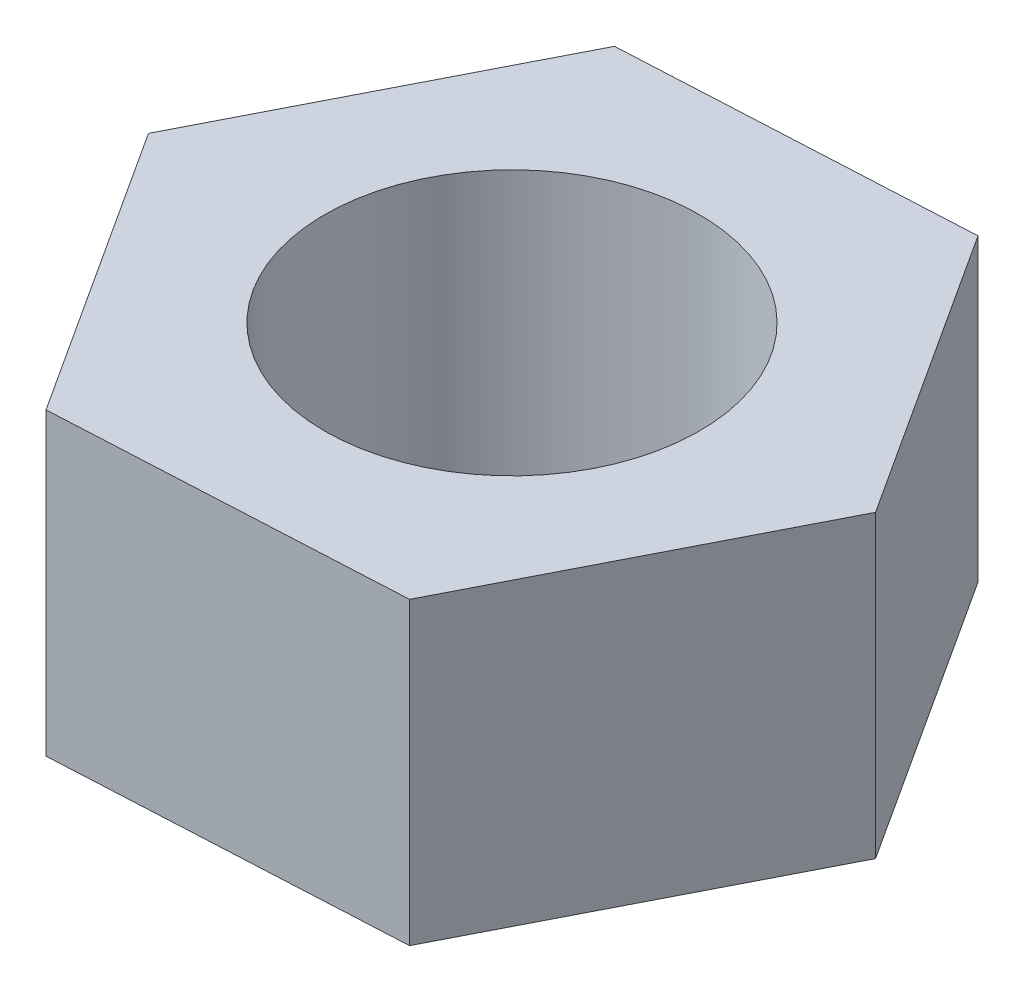
ISO-10303-21;
HEADER;
FILE_DESCRIPTION(('STEP AP214'),'2;1');
FILE_NAME('part.step','',(''),(''),'','','');
FILE_SCHEMA(('AUTOMOTIVE_DESIGN { 1 0 10303 214 1 1 1 1 }'));
ENDSEC;
DATA;
#1=APPLICATION_CONTEXT('core data for automotive mechanical design processes');
#2=APPLICATION_PROTOCOL_DEFINITION('international standard','automotive_design',2000,#1);
#3=PRODUCT_CONTEXT('',#1,'mechanical');
#4=PRODUCT('Part','Part','',(#3));
#5=PRODUCT_RELATED_PRODUCT_CATEGORY('part','',(#4));
#6=PRODUCT_DEFINITION_FORMATION('','',#4);
#7=PRODUCT_DEFINITION_CONTEXT('part definition',#1,'design');
#8=PRODUCT_DEFINITION('design','',#6,#7);
#9=PRODUCT_DEFINITION_SHAPE('','',#8);
#10=(LENGTH_UNIT() NAMED_UNIT(*) SI_UNIT(.MILLI.,.METRE.));
#11=(NAMED_UNIT(*) PLANE_ANGLE_UNIT() SI_UNIT($,.RADIAN.));
#12=(NAMED_UNIT(*) SI_UNIT($,.STERADIAN.) SOLID_ANGLE_UNIT());
#13=UNCERTAINTY_MEASURE_WITH_UNIT(LENGTH_MEASURE(1.E-05),#10,'distance_accuracy_value','');
#14=(GEOMETRIC_REPRESENTATION_CONTEXT(3) GLOBAL_UNCERTAINTY_ASSIGNED_CONTEXT((#13)) GLOBAL_UNIT_ASSIGNED_CONTEXT((#10,
#11,#12)) REPRESENTATION_CONTEXT('',''));
#15=CARTESIAN_POINT('',(0.,0.,0.));
#16=DIRECTION('',(0.,0.,1.));
#17=DIRECTION('',(1.,0.,0.));
#18=AXIS2_PLACEMENT_3D('',#15,#16,#17);
#19=CARTESIAN_POINT('',(0.,10.16,0.));
#20=DIRECTION('',(0.,1.,0.));
#21=DIRECTION('',(0.,0.,1.));
#22=AXIS2_PLACEMENT_3D('',#19,#20,#21);
#23=PLANE('',#22);
#24=DIRECTION('',(0.998697463327456,0.,-0.0510232960842927));
#25=VECTOR('',#24,1.);
#26=CARTESIAN_POINT('',(-5.33984152458119,10.16,10.4460626948957));
#27=LINE('',#26,#25);
#28=CARTESIAN_POINT('',(-5.33984152458119,10.16,10.4460626948957));
#29=VERTEX_POINT('',#28);
#30=CARTESIAN_POINT('',(6.37663490101402,10.16,9.84746975991819));
#31=VERTEX_POINT('',#30);
#32=EDGE_CURVE('E157',#29,#31,#27,.T.);
#33=ORIENTED_EDGE('',*,*,#32,.T.);
#34=DIRECTION('',(0.455161261069915,0.,-0.890409021978801));
#35=VECTOR('',#34,1.);
#36=CARTESIAN_POINT('',(6.37663490101402,10.16,9.84746975991819));
#37=LINE('',#36,#35);
#38=CARTESIAN_POINT('',(11.7164764255952,10.16,-0.598592934977514));
#39=VERTEX_POINT('',#38);
#40=EDGE_CURVE('E104',#31,#39,#37,.T.);
#41=ORIENTED_EDGE('',*,*,#40,.T.);
#42=DIRECTION('',(-0.54353620225754,0.,-0.839385725894508));
#43=VECTOR('',#42,1.);
#44=CARTESIAN_POINT('',(11.7164764255952,10.16,-0.598592934977514));
#45=LINE('',#44,#43);
#46=CARTESIAN_POINT('',(5.33984152458119,10.16,-10.4460626948957));
#47=VERTEX_POINT('',#46);
#48=EDGE_CURVE('E117',#39,#47,#45,.T.);
#49=ORIENTED_EDGE('',*,*,#48,.T.);
#50=DIRECTION('',(-0.998697463327456,0.,0.0510232960842926));
#51=VECTOR('',#50,1.);
#52=CARTESIAN_POINT('',(5.33984152458119,10.16,-10.4460626948957));
#53=LINE('',#52,#51);
#54=CARTESIAN_POINT('',(-6.37663490101401,10.16,-9.84746975991819));
#55=VERTEX_POINT('',#54);
#56=EDGE_CURVE('E111',#47,#55,#53,.T.);
#57=ORIENTED_EDGE('',*,*,#56,.T.);
#58=DIRECTION('',(-0.455161261069915,0.,0.890409021978801));
#59=VECTOR('',#58,1.);
#60=CARTESIAN_POINT('',(-6.37663490101401,10.16,-9.84746975991819));
#61=LINE('',#60,#59);
#62=CARTESIAN_POINT('',(-11.7164764255952,10.16,0.598592934977512));
#63=VERTEX_POINT('',#62);
#64=EDGE_CURVE('E115',#55,#63,#61,.T.);
#65=ORIENTED_EDGE('',*,*,#64,.T.);
#66=DIRECTION('',(0.54353620225754,0.,0.839385725894508));
#67=VECTOR('',#66,1.);
#68=CARTESIAN_POINT('',(-11.7164764255952,10.16,0.598592934977512));
#69=LINE('',#68,#67);
#70=EDGE_CURVE('E67',#63,#29,#69,.T.);
#71=ORIENTED_EDGE('',*,*,#70,.T.);
#72=EDGE_LOOP('',(#33,#41,#49,#57,#65,#71));
#73=FACE_BOUND('',#72,.T.);
#74=CARTESIAN_POINT('',(0.,10.16,0.));
#75=DIRECTION('',(0.,1.,0.));
#76=DIRECTION('',(0.,0.,1.));
#77=AXIS2_PLACEMENT_3D('',#74,#75,#76);
#78=CIRCLE('',#77,6.35);
#79=CARTESIAN_POINT('',(0.,10.16,6.35));
#80=VERTEX_POINT('',#79);
#81=EDGE_CURVE('E145',#80,#80,#78,.T.);
#82=ORIENTED_EDGE('',*,*,#81,.F.);
#83=EDGE_LOOP('',(#82));
#84=FACE_BOUND('',#83,.T.);
#85=ADVANCED_FACE('F49',(#73,#84),#23,.T.);
#86=CARTESIAN_POINT('',(0.,0.,0.));
#87=DIRECTION('',(0.,1.,0.));
#88=DIRECTION('',(0.,0.,1.));
#89=AXIS2_PLACEMENT_3D('',#86,#87,#88);
#90=PLANE('',#89);
#91=DIRECTION('',(0.998697463327456,0.,-0.0510232960842927));
#92=VECTOR('',#91,1.);
#93=CARTESIAN_POINT('',(-5.33984152458119,0.,10.4460626948957));
#94=LINE('',#93,#92);
#95=CARTESIAN_POINT('',(-5.33984152458119,0.,10.4460626948957));
#96=VERTEX_POINT('',#95);
#97=CARTESIAN_POINT('',(6.37663490101402,0.,9.84746975991819));
#98=VERTEX_POINT('',#97);
#99=EDGE_CURVE('E140',#96,#98,#94,.T.);
#100=ORIENTED_EDGE('',*,*,#99,.F.);
#101=DIRECTION('',(0.54353620225754,0.,0.839385725894508));
#102=VECTOR('',#101,1.);
#103=CARTESIAN_POINT('',(-11.7164764255952,0.,0.598592934977512));
#104=LINE('',#103,#102);
#105=CARTESIAN_POINT('',(-11.7164764255952,0.,0.598592934977512));
#106=VERTEX_POINT('',#105);
#107=EDGE_CURVE('E96',#106,#96,#104,.T.);
#108=ORIENTED_EDGE('',*,*,#107,.F.);
#109=DIRECTION('',(-0.455161261069915,0.,0.890409021978801));
#110=VECTOR('',#109,1.);
#111=CARTESIAN_POINT('',(-6.37663490101401,0.,-9.84746975991819));
#112=LINE('',#111,#110);
#113=CARTESIAN_POINT('',(-6.37663490101401,0.,-9.84746975991819));
#114=VERTEX_POINT('',#113);
#115=EDGE_CURVE('E90',#114,#106,#112,.T.);
#116=ORIENTED_EDGE('',*,*,#115,.F.);
#117=DIRECTION('',(-0.998697463327456,0.,0.0510232960842926));
#118=VECTOR('',#117,1.);
#119=CARTESIAN_POINT('',(5.33984152458119,0.,-10.4460626948957));
#120=LINE('',#119,#118);
#121=CARTESIAN_POINT('',(5.33984152458119,0.,-10.4460626948957));
#122=VERTEX_POINT('',#121);
#123=EDGE_CURVE('E126',#122,#114,#120,.T.);
#124=ORIENTED_EDGE('',*,*,#123,.F.);
#125=DIRECTION('',(-0.54353620225754,0.,-0.839385725894508));
#126=VECTOR('',#125,1.);
#127=CARTESIAN_POINT('',(11.7164764255952,0.,-0.598592934977514));
#128=LINE('',#127,#126);
#129=CARTESIAN_POINT('',(11.7164764255952,0.,-0.598592934977514));
#130=VERTEX_POINT('',#129);
#131=EDGE_CURVE('E148',#130,#122,#128,.T.);
#132=ORIENTED_EDGE('',*,*,#131,.F.);
#133=DIRECTION('',(0.455161261069915,0.,-0.890409021978801));
#134=VECTOR('',#133,1.);
#135=CARTESIAN_POINT('',(6.37663490101402,0.,9.84746975991819));
#136=LINE('',#135,#134);
#137=EDGE_CURVE('E144',#98,#130,#136,.T.);
#138=ORIENTED_EDGE('',*,*,#137,.F.);
#139=EDGE_LOOP('',(#100,#108,#116,#124,#132,#138));
#140=FACE_BOUND('',#139,.T.);
#141=CARTESIAN_POINT('',(0.,0.,0.));
#142=DIRECTION('',(0.,1.,0.));
#143=DIRECTION('',(0.,0.,1.));
#144=AXIS2_PLACEMENT_3D('',#141,#142,#143);
#145=CIRCLE('',#144,6.35);
#146=CARTESIAN_POINT('',(0.,0.,6.35));
#147=VERTEX_POINT('',#146);
#148=EDGE_CURVE('E271',#147,#147,#145,.T.);
#149=ORIENTED_EDGE('',*,*,#148,.T.);
#150=EDGE_LOOP('',(#149));
#151=FACE_BOUND('',#150,.T.);
#152=ADVANCED_FACE('F171',(#140,#151),#90,.F.);
#153=CARTESIAN_POINT('',(-5.33984152458119,10.16,10.4460626948957));
#154=DIRECTION('',(-0.0510232960842927,0.,-0.998697463327456));
#155=DIRECTION('',(-0.998697463327456,0.,0.0510232960842927));
#156=AXIS2_PLACEMENT_3D('',#153,#154,#155);
#157=PLANE('',#156);
#158=ORIENTED_EDGE('',*,*,#99,.T.);
#159=DIRECTION('',(0.,-1.,0.));
#160=VECTOR('',#159,1.);
#161=CARTESIAN_POINT('',(6.37663490101402,10.16,9.84746975991819));
#162=LINE('',#161,#160);
#163=EDGE_CURVE('E11',#31,#98,#162,.T.);
#164=ORIENTED_EDGE('',*,*,#163,.F.);
#165=ORIENTED_EDGE('',*,*,#32,.F.);
#166=DIRECTION('',(0.,-1.,0.));
#167=VECTOR('',#166,1.);
#168=CARTESIAN_POINT('',(-5.33984152458119,10.16,10.4460626948957));
#169=LINE('',#168,#167);
#170=EDGE_CURVE('E136',#29,#96,#169,.T.);
#171=ORIENTED_EDGE('',*,*,#170,.T.);
#172=EDGE_LOOP('',(#158,#164,#165,#171));
#173=FACE_BOUND('',#172,.T.);
#174=ADVANCED_FACE('F51',(#173),#157,.F.);
#175=CARTESIAN_POINT('',(6.37663490101402,10.16,9.84746975991819));
#176=DIRECTION('',(-0.890409021978801,0.,-0.455161261069915));
#177=DIRECTION('',(-0.455161261069915,0.,0.890409021978801));
#178=AXIS2_PLACEMENT_3D('',#175,#176,#177);
#179=PLANE('',#178);
#180=ORIENTED_EDGE('',*,*,#137,.T.);
#181=DIRECTION('',(0.,-1.,0.));
#182=VECTOR('',#181,1.);
#183=CARTESIAN_POINT('',(11.7164764255952,10.16,-0.598592934977514));
#184=LINE('',#183,#182);
#185=EDGE_CURVE('E59',#39,#130,#184,.T.);
#186=ORIENTED_EDGE('',*,*,#185,.F.);
#187=ORIENTED_EDGE('',*,*,#40,.F.);
#188=ORIENTED_EDGE('',*,*,#163,.T.);
#189=EDGE_LOOP('',(#180,#186,#187,#188));
#190=FACE_BOUND('',#189,.T.);
#191=ADVANCED_FACE('F196',(#190),#179,.F.);
#192=CARTESIAN_POINT('',(11.7164764255952,10.16,-0.598592934977514));
#193=DIRECTION('',(-0.839385725894508,0.,0.54353620225754));
#194=DIRECTION('',(0.54353620225754,0.,0.839385725894508));
#195=AXIS2_PLACEMENT_3D('',#192,#193,#194);
#196=PLANE('',#195);
#197=ORIENTED_EDGE('',*,*,#131,.T.);
#198=DIRECTION('',(0.,-1.,0.));
#199=VECTOR('',#198,1.);
#200=CARTESIAN_POINT('',(5.33984152458119,10.16,-10.4460626948957));
#201=LINE('',#200,#199);
#202=EDGE_CURVE('E128',#47,#122,#201,.T.);
#203=ORIENTED_EDGE('',*,*,#202,.F.);
#204=ORIENTED_EDGE('',*,*,#48,.F.);
#205=ORIENTED_EDGE('',*,*,#185,.T.);
#206=EDGE_LOOP('',(#197,#203,#204,#205));
#207=FACE_BOUND('',#206,.T.);
#208=ADVANCED_FACE('F168',(#207),#196,.F.);
#209=CARTESIAN_POINT('',(5.33984152458119,10.16,-10.4460626948957));
#210=DIRECTION('',(0.0510232960842926,0.,0.998697463327456));
#211=DIRECTION('',(0.998697463327456,0.,-0.0510232960842926));
#212=AXIS2_PLACEMENT_3D('',#209,#210,#211);
#213=PLANE('',#212);
#214=ORIENTED_EDGE('',*,*,#123,.T.);
#215=DIRECTION('',(0.,-1.,0.));
#216=VECTOR('',#215,1.);
#217=CARTESIAN_POINT('',(-6.37663490101401,10.16,-9.84746975991819));
#218=LINE('',#217,#216);
#219=EDGE_CURVE('E123',#55,#114,#218,.T.);
#220=ORIENTED_EDGE('',*,*,#219,.F.);
#221=ORIENTED_EDGE('',*,*,#56,.F.);
#222=ORIENTED_EDGE('',*,*,#202,.T.);
#223=EDGE_LOOP('',(#214,#220,#221,#222));
#224=FACE_BOUND('',#223,.T.);
#225=ADVANCED_FACE('F124',(#224),#213,.F.);
#226=CARTESIAN_POINT('',(-6.37663490101401,10.16,-9.84746975991819));
#227=DIRECTION('',(0.890409021978801,0.,0.455161261069915));
#228=DIRECTION('',(0.455161261069915,0.,-0.890409021978801));
#229=AXIS2_PLACEMENT_3D('',#226,#227,#228);
#230=PLANE('',#229);
#231=ORIENTED_EDGE('',*,*,#115,.T.);
#232=DIRECTION('',(0.,-1.,0.));
#233=VECTOR('',#232,1.);
#234=CARTESIAN_POINT('',(-11.7164764255952,10.16,0.598592934977512));
#235=LINE('',#234,#233);
#236=EDGE_CURVE('E129',#63,#106,#235,.T.);
#237=ORIENTED_EDGE('',*,*,#236,.F.);
#238=ORIENTED_EDGE('',*,*,#64,.F.);
#239=ORIENTED_EDGE('',*,*,#219,.T.);
#240=EDGE_LOOP('',(#231,#237,#238,#239));
#241=FACE_BOUND('',#240,.T.);
#242=ADVANCED_FACE('F131',(#241),#230,.F.);
#243=CARTESIAN_POINT('',(-11.7164764255952,10.16,0.598592934977512));
#244=DIRECTION('',(0.839385725894508,0.,-0.54353620225754));
#245=DIRECTION('',(-0.54353620225754,0.,-0.839385725894508));
#246=AXIS2_PLACEMENT_3D('',#243,#244,#245);
#247=PLANE('',#246);
#248=ORIENTED_EDGE('',*,*,#107,.T.);
#249=ORIENTED_EDGE('',*,*,#170,.F.);
#250=ORIENTED_EDGE('',*,*,#70,.F.);
#251=ORIENTED_EDGE('',*,*,#236,.T.);
#252=EDGE_LOOP('',(#248,#249,#250,#251));
#253=FACE_BOUND('',#252,.T.);
#254=ADVANCED_FACE('F176',(#253),#247,.F.);
#255=CARTESIAN_POINT('',(0.,10.16,0.));
#256=DIRECTION('',(0.,-1.,0.));
#257=DIRECTION('',(0.,0.,-1.));
#258=AXIS2_PLACEMENT_3D('',#255,#256,#257);
#259=CYLINDRICAL_SURFACE('',#258,6.35);
#260=ORIENTED_EDGE('',*,*,#81,.T.);
#261=EDGE_LOOP('',(#260));
#262=FACE_BOUND('',#261,.T.);
#263=ORIENTED_EDGE('',*,*,#148,.F.);
#264=EDGE_LOOP('',(#263));
#265=FACE_BOUND('',#264,.T.);
#266=ADVANCED_FACE('F178',(#262,#265),#259,.F.);
#267=CLOSED_SHELL('',(#85,#152,#174,#191,#208,#225,#242,#254,#266));
#268=MANIFOLD_SOLID_BREP('B2',#267);
#269=ADVANCED_BREP_SHAPE_REPRESENTATION('',(#18,#268),#14);
#270=SHAPE_DEFINITION_REPRESENTATION(#9,#269);
ENDSEC;
END-ISO-10303-21;
